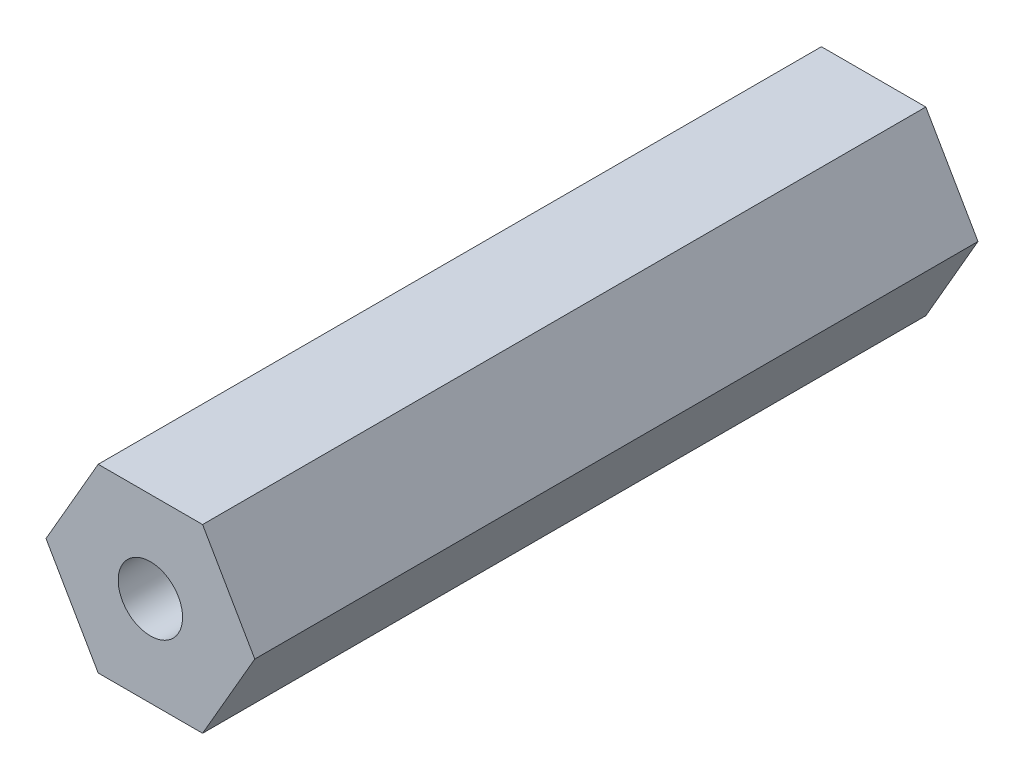
ISO-10303-21;
HEADER;
FILE_DESCRIPTION(('STEP AP214'),'2;1');
FILE_NAME('part.step','',(''),(''),'','','');
FILE_SCHEMA(('AUTOMOTIVE_DESIGN { 1 0 10303 214 1 1 1 1 }'));
ENDSEC;
DATA;
#1=APPLICATION_CONTEXT('core data for automotive mechanical design processes');
#2=APPLICATION_PROTOCOL_DEFINITION('international standard','automotive_design',2000,#1);
#3=PRODUCT_CONTEXT('',#1,'mechanical');
#4=PRODUCT('Part','Part','',(#3));
#5=PRODUCT_RELATED_PRODUCT_CATEGORY('part','',(#4));
#6=PRODUCT_DEFINITION_FORMATION('','',#4);
#7=PRODUCT_DEFINITION_CONTEXT('part definition',#1,'design');
#8=PRODUCT_DEFINITION('design','',#6,#7);
#9=PRODUCT_DEFINITION_SHAPE('','',#8);
#10=(LENGTH_UNIT() NAMED_UNIT(*) SI_UNIT(.MILLI.,.METRE.));
#11=(NAMED_UNIT(*) PLANE_ANGLE_UNIT() SI_UNIT($,.RADIAN.));
#12=(NAMED_UNIT(*) SI_UNIT($,.STERADIAN.) SOLID_ANGLE_UNIT());
#13=UNCERTAINTY_MEASURE_WITH_UNIT(LENGTH_MEASURE(1.E-05),#10,'distance_accuracy_value','');
#14=(GEOMETRIC_REPRESENTATION_CONTEXT(3) GLOBAL_UNCERTAINTY_ASSIGNED_CONTEXT((#13)) GLOBAL_UNIT_ASSIGNED_CONTEXT((#10,
#11,#12)) REPRESENTATION_CONTEXT('',''));
#15=CARTESIAN_POINT('',(0.,0.,0.));
#16=DIRECTION('',(0.,0.,1.));
#17=DIRECTION('',(1.,0.,0.));
#18=AXIS2_PLACEMENT_3D('',#15,#16,#17);
#19=CARTESIAN_POINT('',(-3.66617420935408,0.,-25.4));
#20=DIRECTION('',(-0.86602540378444,0.499999999999997,0.));
#21=DIRECTION('',(-0.499999999999997,-0.86602540378444,0.));
#22=AXIS2_PLACEMENT_3D('',#19,#20,#21);
#23=PLANE('',#22);
#24=DIRECTION('',(-0.499999999999997,-0.86602540378444,0.));
#25=VECTOR('',#24,1.);
#26=CARTESIAN_POINT('',(-3.66617420935408,0.,0.));
#27=LINE('',#26,#25);
#28=CARTESIAN_POINT('',(-1.83308710467704,3.175,0.));
#29=VERTEX_POINT('',#28);
#30=CARTESIAN_POINT('',(-3.66617420935408,0.,0.));
#31=VERTEX_POINT('',#30);
#32=EDGE_CURVE('E114',#29,#31,#27,.T.);
#33=ORIENTED_EDGE('',*,*,#32,.F.);
#34=DIRECTION('',(0.,0.,1.));
#35=VECTOR('',#34,1.);
#36=CARTESIAN_POINT('',(-1.83308710467704,3.175,-25.4));
#37=LINE('',#36,#35);
#38=CARTESIAN_POINT('',(-1.83308710467704,3.175,-25.4));
#39=VERTEX_POINT('',#38);
#40=EDGE_CURVE('E11',#39,#29,#37,.T.);
#41=ORIENTED_EDGE('',*,*,#40,.F.);
#42=DIRECTION('',(-0.499999999999997,-0.86602540378444,0.));
#43=VECTOR('',#42,1.);
#44=CARTESIAN_POINT('',(-3.66617420935408,0.,-25.4));
#45=LINE('',#44,#43);
#46=CARTESIAN_POINT('',(-3.66617420935408,0.,-25.4));
#47=VERTEX_POINT('',#46);
#48=EDGE_CURVE('E132',#39,#47,#45,.T.);
#49=ORIENTED_EDGE('',*,*,#48,.T.);
#50=DIRECTION('',(0.,0.,1.));
#51=VECTOR('',#50,1.);
#52=CARTESIAN_POINT('',(-3.66617420935408,0.,-25.4));
#53=LINE('',#52,#51);
#54=EDGE_CURVE('E39',#47,#31,#53,.T.);
#55=ORIENTED_EDGE('',*,*,#54,.T.);
#56=EDGE_LOOP('',(#33,#41,#49,#55));
#57=FACE_BOUND('',#56,.T.);
#58=ADVANCED_FACE('F36',(#57),#23,.T.);
#59=CARTESIAN_POINT('',(-1.83308710467704,3.175,-25.4));
#60=DIRECTION('',(0.,1.,0.));
#61=DIRECTION('',(0.,0.,1.));
#62=AXIS2_PLACEMENT_3D('',#59,#60,#61);
#63=PLANE('',#62);
#64=DIRECTION('',(-1.,0.,0.));
#65=VECTOR('',#64,1.);
#66=CARTESIAN_POINT('',(-1.83308710467704,3.175,0.));
#67=LINE('',#66,#65);
#68=CARTESIAN_POINT('',(1.83308710467707,3.175,0.));
#69=VERTEX_POINT('',#68);
#70=EDGE_CURVE('E129',#69,#29,#67,.T.);
#71=ORIENTED_EDGE('',*,*,#70,.F.);
#72=DIRECTION('',(0.,0.,1.));
#73=VECTOR('',#72,1.);
#74=CARTESIAN_POINT('',(1.83308710467707,3.175,-25.4));
#75=LINE('',#74,#73);
#76=CARTESIAN_POINT('',(1.83308710467707,3.175,-25.4));
#77=VERTEX_POINT('',#76);
#78=EDGE_CURVE('E44',#77,#69,#75,.T.);
#79=ORIENTED_EDGE('',*,*,#78,.F.);
#80=DIRECTION('',(-1.,0.,0.));
#81=VECTOR('',#80,1.);
#82=CARTESIAN_POINT('',(-1.83308710467704,3.175,-25.4));
#83=LINE('',#82,#81);
#84=EDGE_CURVE('E145',#77,#39,#83,.T.);
#85=ORIENTED_EDGE('',*,*,#84,.T.);
#86=ORIENTED_EDGE('',*,*,#40,.T.);
#87=EDGE_LOOP('',(#71,#79,#85,#86));
#88=FACE_BOUND('',#87,.T.);
#89=ADVANCED_FACE('F160',(#88),#63,.T.);
#90=CARTESIAN_POINT('',(1.83308710467707,3.175,-25.4));
#91=DIRECTION('',(0.86602540378444,0.499999999999998,0.));
#92=DIRECTION('',(-0.499999999999998,0.86602540378444,0.));
#93=AXIS2_PLACEMENT_3D('',#90,#91,#92);
#94=PLANE('',#93);
#95=DIRECTION('',(-0.499999999999998,0.86602540378444,0.));
#96=VECTOR('',#95,1.);
#97=CARTESIAN_POINT('',(1.83308710467707,3.175,0.));
#98=LINE('',#97,#96);
#99=CARTESIAN_POINT('',(3.66617420935412,0.,0.));
#100=VERTEX_POINT('',#99);
#101=EDGE_CURVE('E126',#100,#69,#98,.T.);
#102=ORIENTED_EDGE('',*,*,#101,.F.);
#103=DIRECTION('',(0.,0.,1.));
#104=VECTOR('',#103,1.);
#105=CARTESIAN_POINT('',(3.66617420935412,0.,-25.4));
#106=LINE('',#105,#104);
#107=CARTESIAN_POINT('',(3.66617420935412,0.,-25.4));
#108=VERTEX_POINT('',#107);
#109=EDGE_CURVE('E148',#108,#100,#106,.T.);
#110=ORIENTED_EDGE('',*,*,#109,.F.);
#111=DIRECTION('',(-0.499999999999998,0.86602540378444,0.));
#112=VECTOR('',#111,1.);
#113=CARTESIAN_POINT('',(1.83308710467707,3.175,-25.4));
#114=LINE('',#113,#112);
#115=EDGE_CURVE('E143',#108,#77,#114,.T.);
#116=ORIENTED_EDGE('',*,*,#115,.T.);
#117=ORIENTED_EDGE('',*,*,#78,.T.);
#118=EDGE_LOOP('',(#102,#110,#116,#117));
#119=FACE_BOUND('',#118,.T.);
#120=ADVANCED_FACE('F173',(#119),#94,.T.);
#121=CARTESIAN_POINT('',(3.66617420935412,0.,-25.4));
#122=DIRECTION('',(0.866025403784436,-0.500000000000004,0.));
#123=DIRECTION('',(0.500000000000004,0.866025403784436,0.));
#124=AXIS2_PLACEMENT_3D('',#121,#122,#123);
#125=PLANE('',#124);
#126=DIRECTION('',(0.500000000000004,0.866025403784436,0.));
#127=VECTOR('',#126,1.);
#128=CARTESIAN_POINT('',(3.66617420935412,0.,0.));
#129=LINE('',#128,#127);
#130=CARTESIAN_POINT('',(1.83308710467706,-3.17499999999998,0.));
#131=VERTEX_POINT('',#130);
#132=EDGE_CURVE('E123',#131,#100,#129,.T.);
#133=ORIENTED_EDGE('',*,*,#132,.F.);
#134=DIRECTION('',(0.,0.,1.));
#135=VECTOR('',#134,1.);
#136=CARTESIAN_POINT('',(1.83308710467706,-3.17499999999998,-25.4));
#137=LINE('',#136,#135);
#138=CARTESIAN_POINT('',(1.83308710467706,-3.17499999999998,-25.4));
#139=VERTEX_POINT('',#138);
#140=EDGE_CURVE('E150',#139,#131,#137,.T.);
#141=ORIENTED_EDGE('',*,*,#140,.F.);
#142=DIRECTION('',(0.500000000000004,0.866025403784436,0.));
#143=VECTOR('',#142,1.);
#144=CARTESIAN_POINT('',(3.66617420935412,0.,-25.4));
#145=LINE('',#144,#143);
#146=EDGE_CURVE('E140',#139,#108,#145,.T.);
#147=ORIENTED_EDGE('',*,*,#146,.T.);
#148=ORIENTED_EDGE('',*,*,#109,.T.);
#149=EDGE_LOOP('',(#133,#141,#147,#148));
#150=FACE_BOUND('',#149,.T.);
#151=ADVANCED_FACE('F171',(#150),#125,.T.);
#152=CARTESIAN_POINT('',(1.83308710467706,-3.17499999999998,-25.4));
#153=DIRECTION('',(0.,-1.,0.));
#154=DIRECTION('',(1.,0.,0.));
#155=AXIS2_PLACEMENT_3D('',#152,#153,#154);
#156=PLANE('',#155);
#157=DIRECTION('',(1.,0.,0.));
#158=VECTOR('',#157,1.);
#159=CARTESIAN_POINT('',(1.83308710467706,-3.17499999999998,0.));
#160=LINE('',#159,#158);
#161=CARTESIAN_POINT('',(-1.83308710467703,-3.17499999999998,0.));
#162=VERTEX_POINT('',#161);
#163=EDGE_CURVE('E120',#162,#131,#160,.T.);
#164=ORIENTED_EDGE('',*,*,#163,.F.);
#165=DIRECTION('',(0.,0.,1.));
#166=VECTOR('',#165,1.);
#167=CARTESIAN_POINT('',(-1.83308710467703,-3.17499999999998,-25.4));
#168=LINE('',#167,#166);
#169=CARTESIAN_POINT('',(-1.83308710467703,-3.17499999999998,-25.4));
#170=VERTEX_POINT('',#169);
#171=EDGE_CURVE('E151',#170,#162,#168,.T.);
#172=ORIENTED_EDGE('',*,*,#171,.F.);
#173=DIRECTION('',(1.,0.,0.));
#174=VECTOR('',#173,1.);
#175=CARTESIAN_POINT('',(1.83308710467706,-3.17499999999998,-25.4));
#176=LINE('',#175,#174);
#177=EDGE_CURVE('E137',#170,#139,#176,.T.);
#178=ORIENTED_EDGE('',*,*,#177,.T.);
#179=ORIENTED_EDGE('',*,*,#140,.T.);
#180=EDGE_LOOP('',(#164,#172,#178,#179));
#181=FACE_BOUND('',#180,.T.);
#182=ADVANCED_FACE('F168',(#181),#156,.T.);
#183=CARTESIAN_POINT('',(-1.83308710467703,-3.17499999999998,-25.4));
#184=DIRECTION('',(-0.866025403784437,-0.500000000000002,0.));
#185=DIRECTION('',(0.500000000000002,-0.866025403784438,0.));
#186=AXIS2_PLACEMENT_3D('',#183,#184,#185);
#187=PLANE('',#186);
#188=DIRECTION('',(0.500000000000002,-0.866025403784437,0.));
#189=VECTOR('',#188,1.);
#190=CARTESIAN_POINT('',(-1.83308710467703,-3.17499999999998,0.));
#191=LINE('',#190,#189);
#192=EDGE_CURVE('E117',#31,#162,#191,.T.);
#193=ORIENTED_EDGE('',*,*,#192,.F.);
#194=ORIENTED_EDGE('',*,*,#54,.F.);
#195=DIRECTION('',(0.500000000000002,-0.866025403784437,0.));
#196=VECTOR('',#195,1.);
#197=CARTESIAN_POINT('',(-1.83308710467703,-3.17499999999998,-25.4));
#198=LINE('',#197,#196);
#199=EDGE_CURVE('E134',#47,#170,#198,.T.);
#200=ORIENTED_EDGE('',*,*,#199,.T.);
#201=ORIENTED_EDGE('',*,*,#171,.T.);
#202=EDGE_LOOP('',(#193,#194,#200,#201));
#203=FACE_BOUND('',#202,.T.);
#204=ADVANCED_FACE('F156',(#203),#187,.T.);
#205=CARTESIAN_POINT('',(-5.49926131403111,-3.17499999999997,-25.4));
#206=DIRECTION('',(0.,0.,1.));
#207=DIRECTION('',(1.,0.,0.));
#208=AXIS2_PLACEMENT_3D('',#205,#206,#207);
#209=PLANE('',#208);
#210=CARTESIAN_POINT('',(0.,0.,-25.4));
#211=DIRECTION('',(0.,0.,-1.));
#212=DIRECTION('',(-1.,0.,0.));
#213=AXIS2_PLACEMENT_3D('',#210,#211,#212);
#214=CIRCLE('',#213,1.13029999999999);
#215=CARTESIAN_POINT('',(-1.13029999999999,0.,-25.4));
#216=VERTEX_POINT('',#215);
#217=EDGE_CURVE('E104',#216,#216,#214,.T.);
#218=ORIENTED_EDGE('',*,*,#217,.F.);
#219=EDGE_LOOP('',(#218));
#220=FACE_BOUND('',#219,.T.);
#221=ORIENTED_EDGE('',*,*,#48,.F.);
#222=ORIENTED_EDGE('',*,*,#84,.F.);
#223=ORIENTED_EDGE('',*,*,#115,.F.);
#224=ORIENTED_EDGE('',*,*,#146,.F.);
#225=ORIENTED_EDGE('',*,*,#177,.F.);
#226=ORIENTED_EDGE('',*,*,#199,.F.);
#227=EDGE_LOOP('',(#221,#222,#223,#224,#225,#226));
#228=FACE_BOUND('',#227,.T.);
#229=ADVANCED_FACE('F164',(#220,#228),#209,.F.);
#230=CARTESIAN_POINT('',(-5.49926131403111,-3.17499999999997,0.));
#231=DIRECTION('',(0.,0.,1.));
#232=DIRECTION('',(1.,0.,0.));
#233=AXIS2_PLACEMENT_3D('',#230,#231,#232);
#234=PLANE('',#233);
#235=CARTESIAN_POINT('',(0.,0.,0.));
#236=DIRECTION('',(0.,0.,1.));
#237=DIRECTION('',(1.,0.,0.));
#238=AXIS2_PLACEMENT_3D('',#235,#236,#237);
#239=CIRCLE('',#238,1.13029999999999);
#240=CARTESIAN_POINT('',(1.13029999999999,0.,0.));
#241=VERTEX_POINT('',#240);
#242=EDGE_CURVE('E103',#241,#241,#239,.T.);
#243=ORIENTED_EDGE('',*,*,#242,.F.);
#244=EDGE_LOOP('',(#243));
#245=FACE_BOUND('',#244,.T.);
#246=ORIENTED_EDGE('',*,*,#32,.T.);
#247=ORIENTED_EDGE('',*,*,#192,.T.);
#248=ORIENTED_EDGE('',*,*,#163,.T.);
#249=ORIENTED_EDGE('',*,*,#132,.T.);
#250=ORIENTED_EDGE('',*,*,#101,.T.);
#251=ORIENTED_EDGE('',*,*,#70,.T.);
#252=EDGE_LOOP('',(#246,#247,#248,#249,#250,#251));
#253=FACE_BOUND('',#252,.T.);
#254=ADVANCED_FACE('F158',(#245,#253),#234,.T.);
#255=CARTESIAN_POINT('',(0.,0.,-7.59459999999999));
#256=DIRECTION('',(0.,0.,1.));
#257=DIRECTION('',(1.,0.,0.));
#258=AXIS2_PLACEMENT_3D('',#255,#256,#257);
#259=CONICAL_SURFACE('',#258,1.13029999999999,1.02974425867665);
#260=CARTESIAN_POINT('',(0.,0.,-8.27375275768684));
#261=VERTEX_POINT('',#260);
#262=VERTEX_LOOP('',#261);
#263=FACE_BOUND('',#262,.T.);
#264=CARTESIAN_POINT('',(0.,0.,-7.59459999999999));
#265=DIRECTION('',(0.,0.,1.));
#266=DIRECTION('',(1.,0.,0.));
#267=AXIS2_PLACEMENT_3D('',#264,#265,#266);
#268=CIRCLE('',#267,1.13029999999999);
#269=CARTESIAN_POINT('',(1.13029999999999,0.,-7.59459999999999));
#270=VERTEX_POINT('',#269);
#271=EDGE_CURVE('E107',#270,#270,#268,.T.);
#272=ORIENTED_EDGE('',*,*,#271,.T.);
#273=EDGE_LOOP('',(#272));
#274=FACE_BOUND('',#273,.T.);
#275=ADVANCED_FACE('F225',(#263,#274),#259,.F.);
#276=CARTESIAN_POINT('',(0.,0.,0.));
#277=DIRECTION('',(0.,0.,1.));
#278=DIRECTION('',(1.,0.,0.));
#279=AXIS2_PLACEMENT_3D('',#276,#277,#278);
#280=CYLINDRICAL_SURFACE('',#279,1.13029999999999);
#281=ORIENTED_EDGE('',*,*,#271,.F.);
#282=EDGE_LOOP('',(#281));
#283=FACE_BOUND('',#282,.T.);
#284=ORIENTED_EDGE('',*,*,#242,.T.);
#285=EDGE_LOOP('',(#284));
#286=FACE_BOUND('',#285,.T.);
#287=ADVANCED_FACE('F97',(#283,#286),#280,.F.);
#288=CARTESIAN_POINT('',(0.,0.,-17.8054));
#289=DIRECTION('',(0.,0.,-1.));
#290=DIRECTION('',(-1.,0.,0.));
#291=AXIS2_PLACEMENT_3D('',#288,#289,#290);
#292=CONICAL_SURFACE('',#291,1.13029999999999,1.02974425867665);
#293=CARTESIAN_POINT('',(0.,0.,-17.1262472423132));
#294=VERTEX_POINT('',#293);
#295=VERTEX_LOOP('',#294);
#296=FACE_BOUND('',#295,.T.);
#297=CARTESIAN_POINT('',(0.,0.,-17.8054));
#298=DIRECTION('',(0.,0.,-1.));
#299=DIRECTION('',(-1.,0.,0.));
#300=AXIS2_PLACEMENT_3D('',#297,#298,#299);
#301=CIRCLE('',#300,1.13029999999999);
#302=CARTESIAN_POINT('',(-1.13029999999999,0.,-17.8054));
#303=VERTEX_POINT('',#302);
#304=EDGE_CURVE('E101',#303,#303,#301,.T.);
#305=ORIENTED_EDGE('',*,*,#304,.T.);
#306=EDGE_LOOP('',(#305));
#307=FACE_BOUND('',#306,.T.);
#308=ADVANCED_FACE('F93',(#296,#307),#292,.F.);
#309=CARTESIAN_POINT('',(0.,0.,-25.4));
#310=DIRECTION('',(0.,0.,-1.));
#311=DIRECTION('',(-1.,0.,0.));
#312=AXIS2_PLACEMENT_3D('',#309,#310,#311);
#313=CYLINDRICAL_SURFACE('',#312,1.13029999999999);
#314=ORIENTED_EDGE('',*,*,#304,.F.);
#315=EDGE_LOOP('',(#314));
#316=FACE_BOUND('',#315,.T.);
#317=ORIENTED_EDGE('',*,*,#217,.T.);
#318=EDGE_LOOP('',(#317));
#319=FACE_BOUND('',#318,.T.);
#320=ADVANCED_FACE('F96',(#316,#319),#313,.F.);
#321=CLOSED_SHELL('',(#58,#89,#120,#151,#182,#204,#229,#254,#275,#287,#308,#320));
#322=MANIFOLD_SOLID_BREP('B2',#321);
#323=ADVANCED_BREP_SHAPE_REPRESENTATION('',(#18,#322),#14);
#324=SHAPE_DEFINITION_REPRESENTATION(#9,#323);
ENDSEC;
END-ISO-10303-21;
